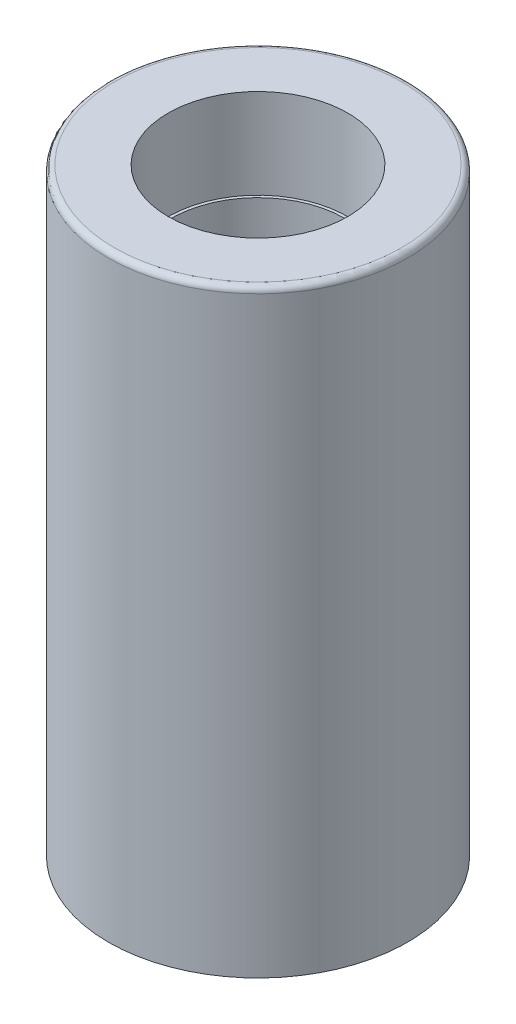
ISO-10303-21;
HEADER;
FILE_DESCRIPTION(('STEP AP214'),'2;1');
FILE_NAME('part.step','',(''),(''),'','','');
FILE_SCHEMA(('AUTOMOTIVE_DESIGN { 1 0 10303 214 1 1 1 1 }'));
ENDSEC;
DATA;
#1=APPLICATION_CONTEXT('core data for automotive mechanical design processes');
#2=APPLICATION_PROTOCOL_DEFINITION('international standard','automotive_design',2000,#1);
#3=PRODUCT_CONTEXT('',#1,'mechanical');
#4=PRODUCT('Part','Part','',(#3));
#5=PRODUCT_RELATED_PRODUCT_CATEGORY('part','',(#4));
#6=PRODUCT_DEFINITION_FORMATION('','',#4);
#7=PRODUCT_DEFINITION_CONTEXT('part definition',#1,'design');
#8=PRODUCT_DEFINITION('design','',#6,#7);
#9=PRODUCT_DEFINITION_SHAPE('','',#8);
#10=(LENGTH_UNIT() NAMED_UNIT(*) SI_UNIT(.MILLI.,.METRE.));
#11=(NAMED_UNIT(*) PLANE_ANGLE_UNIT() SI_UNIT($,.RADIAN.));
#12=(NAMED_UNIT(*) SI_UNIT($,.STERADIAN.) SOLID_ANGLE_UNIT());
#13=UNCERTAINTY_MEASURE_WITH_UNIT(LENGTH_MEASURE(1.E-05),#10,'distance_accuracy_value','');
#14=(GEOMETRIC_REPRESENTATION_CONTEXT(3) GLOBAL_UNCERTAINTY_ASSIGNED_CONTEXT((#13)) GLOBAL_UNIT_ASSIGNED_CONTEXT((#10,
#11,#12)) REPRESENTATION_CONTEXT('',''));
#15=CARTESIAN_POINT('',(0.,0.,0.));
#16=DIRECTION('',(0.,0.,1.));
#17=DIRECTION('',(1.,0.,0.));
#18=AXIS2_PLACEMENT_3D('',#15,#16,#17);
#19=CARTESIAN_POINT('',(0.,0.,0.));
#20=DIRECTION('',(0.,1.,0.));
#21=DIRECTION('',(0.,0.,1.));
#22=AXIS2_PLACEMENT_3D('',#19,#20,#21);
#23=CYLINDRICAL_SURFACE('',#22,2.9);
#24=CARTESIAN_POINT('',(0.,0.,0.));
#25=DIRECTION('',(0.,1.,0.));
#26=DIRECTION('',(0.,0.,1.));
#27=AXIS2_PLACEMENT_3D('',#24,#25,#26);
#28=CIRCLE('',#27,2.9);
#29=CARTESIAN_POINT('',(0.,0.,2.9));
#30=VERTEX_POINT('',#29);
#31=EDGE_CURVE('E54',#30,#30,#28,.T.);
#32=ORIENTED_EDGE('',*,*,#31,.F.);
#33=EDGE_LOOP('',(#32));
#34=FACE_BOUND('',#33,.T.);
#35=CARTESIAN_POINT('',(0.,17.,0.));
#36=DIRECTION('',(0.,1.,0.));
#37=DIRECTION('',(0.,0.,1.));
#38=AXIS2_PLACEMENT_3D('',#35,#36,#37);
#39=CIRCLE('',#38,2.9);
#40=CARTESIAN_POINT('',(0.,17.,2.9));
#41=VERTEX_POINT('',#40);
#42=EDGE_CURVE('E57',#41,#41,#39,.F.);
#43=ORIENTED_EDGE('',*,*,#42,.F.);
#44=EDGE_LOOP('',(#43));
#45=FACE_BOUND('',#44,.T.);
#46=ADVANCED_FACE('F36',(#34,#45),#23,.F.);
#47=CARTESIAN_POINT('',(0.,20.,0.));
#48=DIRECTION('',(0.,-1.,0.));
#49=DIRECTION('',(0.,0.,-1.));
#50=AXIS2_PLACEMENT_3D('',#47,#48,#49);
#51=CYLINDRICAL_SURFACE('',#50,5.);
#52=CARTESIAN_POINT('',(0.,19.8,0.));
#53=DIRECTION('',(0.,1.,0.));
#54=DIRECTION('',(0.,0.,1.));
#55=AXIS2_PLACEMENT_3D('',#52,#53,#54);
#56=CIRCLE('',#55,5.);
#57=CARTESIAN_POINT('',(0.,19.8,5.));
#58=VERTEX_POINT('',#57);
#59=EDGE_CURVE('E10',#58,#58,#56,.F.);
#60=ORIENTED_EDGE('',*,*,#59,.T.);
#61=EDGE_LOOP('',(#60));
#62=FACE_BOUND('',#61,.T.);
#63=CARTESIAN_POINT('',(0.,0.,0.));
#64=DIRECTION('',(0.,1.,0.));
#65=DIRECTION('',(0.,0.,1.));
#66=AXIS2_PLACEMENT_3D('',#63,#64,#65);
#67=CIRCLE('',#66,5.);
#68=CARTESIAN_POINT('',(0.,0.,5.));
#69=VERTEX_POINT('',#68);
#70=EDGE_CURVE('E49',#69,#69,#67,.T.);
#71=ORIENTED_EDGE('',*,*,#70,.T.);
#72=EDGE_LOOP('',(#71));
#73=FACE_BOUND('',#72,.T.);
#74=ADVANCED_FACE('F85',(#62,#73),#51,.T.);
#75=CARTESIAN_POINT('',(0.,20.,0.));
#76=DIRECTION('',(0.,1.,0.));
#77=DIRECTION('',(0.,0.,1.));
#78=AXIS2_PLACEMENT_3D('',#75,#76,#77);
#79=PLANE('',#78);
#80=CARTESIAN_POINT('',(0.,20.,0.));
#81=DIRECTION('',(0.,1.,0.));
#82=DIRECTION('',(0.,0.,1.));
#83=AXIS2_PLACEMENT_3D('',#80,#81,#82);
#84=CIRCLE('',#83,4.80000000000001);
#85=CARTESIAN_POINT('',(0.,20.,4.80000000000001));
#86=VERTEX_POINT('',#85);
#87=EDGE_CURVE('E44',#86,#86,#84,.T.);
#88=ORIENTED_EDGE('',*,*,#87,.T.);
#89=EDGE_LOOP('',(#88));
#90=FACE_BOUND('',#89,.T.);
#91=CARTESIAN_POINT('',(0.,20.,0.));
#92=DIRECTION('',(0.,1.,0.));
#93=DIRECTION('',(0.,0.,1.));
#94=AXIS2_PLACEMENT_3D('',#91,#92,#93);
#95=CIRCLE('',#94,3.);
#96=CARTESIAN_POINT('',(0.,20.,3.));
#97=VERTEX_POINT('',#96);
#98=EDGE_CURVE('E65',#97,#97,#95,.T.);
#99=ORIENTED_EDGE('',*,*,#98,.F.);
#100=EDGE_LOOP('',(#99));
#101=FACE_BOUND('',#100,.T.);
#102=ADVANCED_FACE('F82',(#90,#101),#79,.T.);
#103=CARTESIAN_POINT('',(0.,0.,0.));
#104=DIRECTION('',(0.,1.,0.));
#105=DIRECTION('',(0.,0.,1.));
#106=AXIS2_PLACEMENT_3D('',#103,#104,#105);
#107=PLANE('',#106);
#108=ORIENTED_EDGE('',*,*,#31,.T.);
#109=EDGE_LOOP('',(#108));
#110=FACE_BOUND('',#109,.T.);
#111=ORIENTED_EDGE('',*,*,#70,.F.);
#112=EDGE_LOOP('',(#111));
#113=FACE_BOUND('',#112,.T.);
#114=ADVANCED_FACE('F84',(#110,#113),#107,.F.);
#115=CARTESIAN_POINT('',(0.,17.,0.));
#116=DIRECTION('',(0.,1.,0.));
#117=DIRECTION('',(0.,0.,1.));
#118=AXIS2_PLACEMENT_3D('',#115,#116,#117);
#119=PLANE('',#118);
#120=CARTESIAN_POINT('',(0.,17.,0.));
#121=DIRECTION('',(0.,1.,0.));
#122=DIRECTION('',(0.,0.,1.));
#123=AXIS2_PLACEMENT_3D('',#120,#121,#122);
#124=CIRCLE('',#123,3.);
#125=CARTESIAN_POINT('',(0.,17.,3.));
#126=VERTEX_POINT('',#125);
#127=EDGE_CURVE('E60',#126,#126,#124,.T.);
#128=ORIENTED_EDGE('',*,*,#127,.T.);
#129=EDGE_LOOP('',(#128));
#130=FACE_BOUND('',#129,.T.);
#131=ORIENTED_EDGE('',*,*,#42,.T.);
#132=EDGE_LOOP('',(#131));
#133=FACE_BOUND('',#132,.T.);
#134=ADVANCED_FACE('F73',(#130,#133),#119,.T.);
#135=CARTESIAN_POINT('',(0.,17.,0.));
#136=DIRECTION('',(0.,1.,0.));
#137=DIRECTION('',(0.,0.,1.));
#138=AXIS2_PLACEMENT_3D('',#135,#136,#137);
#139=CYLINDRICAL_SURFACE('',#138,3.);
#140=ORIENTED_EDGE('',*,*,#127,.F.);
#141=EDGE_LOOP('',(#140));
#142=FACE_BOUND('',#141,.T.);
#143=ORIENTED_EDGE('',*,*,#98,.T.);
#144=EDGE_LOOP('',(#143));
#145=FACE_BOUND('',#144,.T.);
#146=ADVANCED_FACE('F76',(#142,#145),#139,.F.);
#147=CARTESIAN_POINT('',(0.,19.8,0.));
#148=DIRECTION('',(0.,1.,0.));
#149=DIRECTION('',(0.,0.,1.));
#150=AXIS2_PLACEMENT_3D('',#147,#148,#149);
#151=TOROIDAL_SURFACE('',#150,4.80000000000001,0.2);
#152=ORIENTED_EDGE('',*,*,#59,.F.);
#153=EDGE_LOOP('',(#152));
#154=FACE_BOUND('',#153,.T.);
#155=ORIENTED_EDGE('',*,*,#87,.F.);
#156=EDGE_LOOP('',(#155));
#157=FACE_BOUND('',#156,.T.);
#158=ADVANCED_FACE('F38',(#154,#157),#151,.T.);
#159=CLOSED_SHELL('',(#46,#74,#102,#114,#134,#146,#158));
#160=MANIFOLD_SOLID_BREP('B2',#159);
#161=ADVANCED_BREP_SHAPE_REPRESENTATION('',(#18,#160),#14);
#162=SHAPE_DEFINITION_REPRESENTATION(#9,#161);
ENDSEC;
END-ISO-10303-21;
